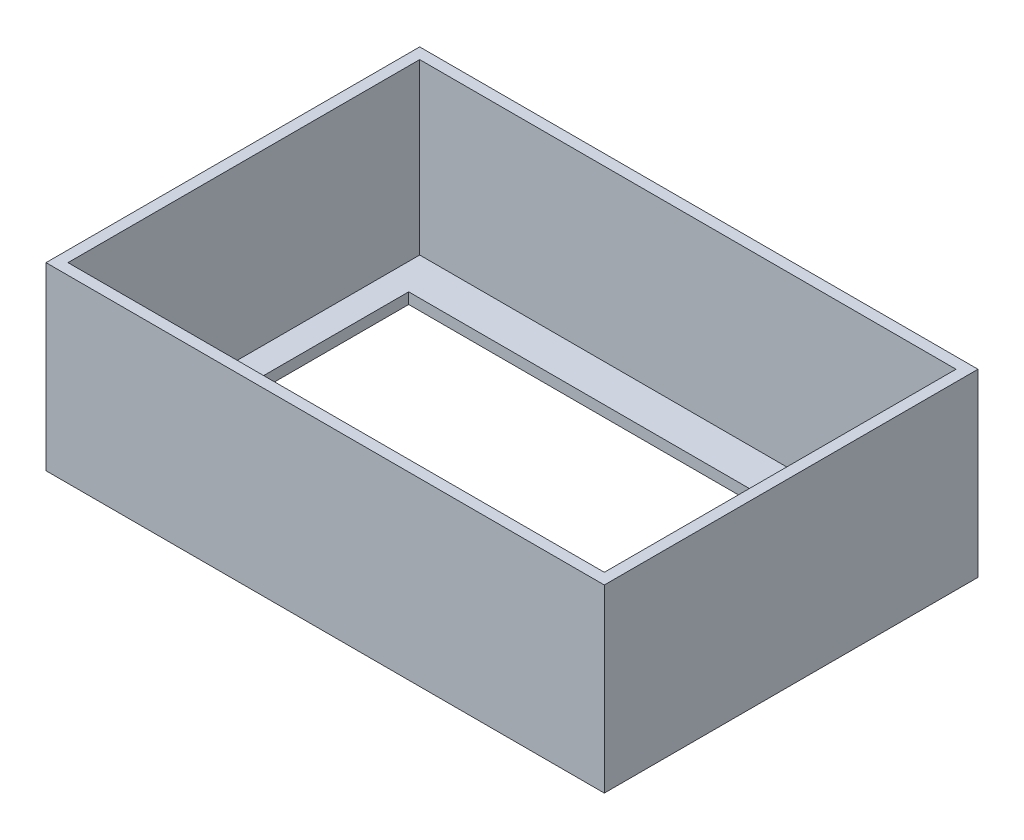
ISO-10303-21;
HEADER;
FILE_DESCRIPTION(('STEP AP214'),'2;1');
FILE_NAME('part.step','',(''),(''),'','','');
FILE_SCHEMA(('AUTOMOTIVE_DESIGN { 1 0 10303 214 1 1 1 1 }'));
ENDSEC;
DATA;
#1=APPLICATION_CONTEXT('core data for automotive mechanical design processes');
#2=APPLICATION_PROTOCOL_DEFINITION('international standard','automotive_design',2000,#1);
#3=PRODUCT_CONTEXT('',#1,'mechanical');
#4=PRODUCT('Part','Part','',(#3));
#5=PRODUCT_RELATED_PRODUCT_CATEGORY('part','',(#4));
#6=PRODUCT_DEFINITION_FORMATION('','',#4);
#7=PRODUCT_DEFINITION_CONTEXT('part definition',#1,'design');
#8=PRODUCT_DEFINITION('design','',#6,#7);
#9=PRODUCT_DEFINITION_SHAPE('','',#8);
#10=(LENGTH_UNIT() NAMED_UNIT(*) SI_UNIT(.MILLI.,.METRE.));
#11=(NAMED_UNIT(*) PLANE_ANGLE_UNIT() SI_UNIT($,.RADIAN.));
#12=(NAMED_UNIT(*) SI_UNIT($,.STERADIAN.) SOLID_ANGLE_UNIT());
#13=UNCERTAINTY_MEASURE_WITH_UNIT(LENGTH_MEASURE(1.E-05),#10,'distance_accuracy_value','');
#14=(GEOMETRIC_REPRESENTATION_CONTEXT(3) GLOBAL_UNCERTAINTY_ASSIGNED_CONTEXT((#13)) GLOBAL_UNIT_ASSIGNED_CONTEXT((#10,
#11,#12)) REPRESENTATION_CONTEXT('',''));
#15=CARTESIAN_POINT('',(0.,0.,0.));
#16=DIRECTION('',(0.,0.,1.));
#17=DIRECTION('',(1.,0.,0.));
#18=AXIS2_PLACEMENT_3D('',#15,#16,#17);
#19=CARTESIAN_POINT('',(0.,2.5,0.));
#20=DIRECTION('',(1.,0.,0.));
#21=DIRECTION('',(0.,0.,-1.));
#22=AXIS2_PLACEMENT_3D('',#19,#20,#21);
#23=PLANE('',#22);
#24=DIRECTION('',(0.,0.,1.));
#25=VECTOR('',#24,1.);
#26=CARTESIAN_POINT('',(0.,0.,0.));
#27=LINE('',#26,#25);
#28=CARTESIAN_POINT('',(0.,0.,-85.));
#29=VERTEX_POINT('',#28);
#30=CARTESIAN_POINT('',(0.,0.,0.));
#31=VERTEX_POINT('',#30);
#32=EDGE_CURVE('E198',#29,#31,#27,.T.);
#33=ORIENTED_EDGE('',*,*,#32,.T.);
#34=DIRECTION('',(0.,-1.,0.));
#35=VECTOR('',#34,1.);
#36=CARTESIAN_POINT('',(0.,2.5,0.));
#37=LINE('',#36,#35);
#38=CARTESIAN_POINT('',(0.,41.,0.));
#39=VERTEX_POINT('',#38);
#40=EDGE_CURVE('E11',#39,#31,#37,.T.);
#41=ORIENTED_EDGE('',*,*,#40,.F.);
#42=DIRECTION('',(0.,0.,1.));
#43=VECTOR('',#42,1.);
#44=CARTESIAN_POINT('',(0.,41.,0.));
#45=LINE('',#44,#43);
#46=CARTESIAN_POINT('',(0.,41.,-85.));
#47=VERTEX_POINT('',#46);
#48=EDGE_CURVE('E186',#47,#39,#45,.T.);
#49=ORIENTED_EDGE('',*,*,#48,.F.);
#50=DIRECTION('',(0.,-1.,0.));
#51=VECTOR('',#50,1.);
#52=CARTESIAN_POINT('',(0.,2.5,-85.));
#53=LINE('',#52,#51);
#54=EDGE_CURVE('E207',#47,#29,#53,.T.);
#55=ORIENTED_EDGE('',*,*,#54,.T.);
#56=EDGE_LOOP('',(#33,#41,#49,#55));
#57=FACE_BOUND('',#56,.T.);
#58=ADVANCED_FACE('F32',(#57),#23,.F.);
#59=CARTESIAN_POINT('',(0.,2.5,0.));
#60=DIRECTION('',(0.,0.,-1.));
#61=DIRECTION('',(-1.,0.,0.));
#62=AXIS2_PLACEMENT_3D('',#59,#60,#61);
#63=PLANE('',#62);
#64=DIRECTION('',(1.,0.,0.));
#65=VECTOR('',#64,1.);
#66=CARTESIAN_POINT('',(0.,0.,0.));
#67=LINE('',#66,#65);
#68=CARTESIAN_POINT('',(127.,0.,0.));
#69=VERTEX_POINT('',#68);
#70=EDGE_CURVE('E201',#31,#69,#67,.T.);
#71=ORIENTED_EDGE('',*,*,#70,.T.);
#72=DIRECTION('',(0.,-1.,0.));
#73=VECTOR('',#72,1.);
#74=CARTESIAN_POINT('',(127.,2.5,0.));
#75=LINE('',#74,#73);
#76=CARTESIAN_POINT('',(127.,41.,0.));
#77=VERTEX_POINT('',#76);
#78=EDGE_CURVE('E39',#77,#69,#75,.T.);
#79=ORIENTED_EDGE('',*,*,#78,.F.);
#80=DIRECTION('',(1.,0.,0.));
#81=VECTOR('',#80,1.);
#82=CARTESIAN_POINT('',(127.,41.,0.));
#83=LINE('',#82,#81);
#84=EDGE_CURVE('E189',#39,#77,#83,.T.);
#85=ORIENTED_EDGE('',*,*,#84,.F.);
#86=ORIENTED_EDGE('',*,*,#40,.T.);
#87=EDGE_LOOP('',(#71,#79,#85,#86));
#88=FACE_BOUND('',#87,.T.);
#89=ADVANCED_FACE('F231',(#88),#63,.F.);
#90=CARTESIAN_POINT('',(127.,2.5,0.));
#91=DIRECTION('',(-1.,0.,0.));
#92=DIRECTION('',(0.,0.,1.));
#93=AXIS2_PLACEMENT_3D('',#90,#91,#92);
#94=PLANE('',#93);
#95=DIRECTION('',(0.,0.,-1.));
#96=VECTOR('',#95,1.);
#97=CARTESIAN_POINT('',(127.,0.,0.));
#98=LINE('',#97,#96);
#99=CARTESIAN_POINT('',(127.,0.,-85.));
#100=VERTEX_POINT('',#99);
#101=EDGE_CURVE('E203',#69,#100,#98,.T.);
#102=ORIENTED_EDGE('',*,*,#101,.T.);
#103=DIRECTION('',(0.,-1.,0.));
#104=VECTOR('',#103,1.);
#105=CARTESIAN_POINT('',(127.,2.5,-85.));
#106=LINE('',#105,#104);
#107=CARTESIAN_POINT('',(127.,41.,-85.));
#108=VERTEX_POINT('',#107);
#109=EDGE_CURVE('E210',#108,#100,#106,.T.);
#110=ORIENTED_EDGE('',*,*,#109,.F.);
#111=DIRECTION('',(0.,0.,-1.));
#112=VECTOR('',#111,1.);
#113=CARTESIAN_POINT('',(127.,41.,-85.));
#114=LINE('',#113,#112);
#115=EDGE_CURVE('E192',#77,#108,#114,.T.);
#116=ORIENTED_EDGE('',*,*,#115,.F.);
#117=ORIENTED_EDGE('',*,*,#78,.T.);
#118=EDGE_LOOP('',(#102,#110,#116,#117));
#119=FACE_BOUND('',#118,.T.);
#120=ADVANCED_FACE('F216',(#119),#94,.F.);
#121=CARTESIAN_POINT('',(0.,2.5,-85.));
#122=DIRECTION('',(0.,0.,1.));
#123=DIRECTION('',(1.,0.,0.));
#124=AXIS2_PLACEMENT_3D('',#121,#122,#123);
#125=PLANE('',#124);
#126=DIRECTION('',(-1.,0.,0.));
#127=VECTOR('',#126,1.);
#128=CARTESIAN_POINT('',(0.,0.,-85.));
#129=LINE('',#128,#127);
#130=EDGE_CURVE('E205',#100,#29,#129,.T.);
#131=ORIENTED_EDGE('',*,*,#130,.T.);
#132=ORIENTED_EDGE('',*,*,#54,.F.);
#133=DIRECTION('',(-1.,0.,0.));
#134=VECTOR('',#133,1.);
#135=CARTESIAN_POINT('',(0.,41.,-85.));
#136=LINE('',#135,#134);
#137=EDGE_CURVE('E195',#108,#47,#136,.T.);
#138=ORIENTED_EDGE('',*,*,#137,.F.);
#139=ORIENTED_EDGE('',*,*,#109,.T.);
#140=EDGE_LOOP('',(#131,#132,#138,#139));
#141=FACE_BOUND('',#140,.T.);
#142=ADVANCED_FACE('F224',(#141),#125,.F.);
#143=CARTESIAN_POINT('',(0.,0.,0.));
#144=DIRECTION('',(0.,-1.,0.));
#145=DIRECTION('',(0.,0.,-1.));
#146=AXIS2_PLACEMENT_3D('',#143,#144,#145);
#147=PLANE('',#146);
#148=DIRECTION('',(0.,0.,-1.));
#149=VECTOR('',#148,1.);
#150=CARTESIAN_POINT('',(8.50000000000001,0.,-5.5));
#151=LINE('',#150,#149);
#152=CARTESIAN_POINT('',(8.50000000000001,0.,-5.5));
#153=VERTEX_POINT('',#152);
#154=CARTESIAN_POINT('',(8.50000000000001,0.,-74.));
#155=VERTEX_POINT('',#154);
#156=EDGE_CURVE('E54',#153,#155,#151,.T.);
#157=ORIENTED_EDGE('',*,*,#156,.F.);
#158=DIRECTION('',(-1.,0.,0.));
#159=VECTOR('',#158,1.);
#160=CARTESIAN_POINT('',(8.50000000000001,0.,-5.5));
#161=LINE('',#160,#159);
#162=CARTESIAN_POINT('',(118.5,0.,-5.49999999999999));
#163=VERTEX_POINT('',#162);
#164=EDGE_CURVE('E138',#163,#153,#161,.T.);
#165=ORIENTED_EDGE('',*,*,#164,.F.);
#166=DIRECTION('',(0.,0.,1.));
#167=VECTOR('',#166,1.);
#168=CARTESIAN_POINT('',(118.5,0.,-5.49999999999999));
#169=LINE('',#168,#167);
#170=CARTESIAN_POINT('',(118.5,0.,-74.));
#171=VERTEX_POINT('',#170);
#172=EDGE_CURVE('E141',#171,#163,#169,.T.);
#173=ORIENTED_EDGE('',*,*,#172,.F.);
#174=DIRECTION('',(1.,0.,0.));
#175=VECTOR('',#174,1.);
#176=CARTESIAN_POINT('',(8.50000000000001,0.,-74.));
#177=LINE('',#176,#175);
#178=EDGE_CURVE('E147',#155,#171,#177,.T.);
#179=ORIENTED_EDGE('',*,*,#178,.F.);
#180=EDGE_LOOP('',(#157,#165,#173,#179));
#181=FACE_BOUND('',#180,.T.);
#182=ORIENTED_EDGE('',*,*,#32,.F.);
#183=ORIENTED_EDGE('',*,*,#130,.F.);
#184=ORIENTED_EDGE('',*,*,#101,.F.);
#185=ORIENTED_EDGE('',*,*,#70,.F.);
#186=EDGE_LOOP('',(#182,#183,#184,#185));
#187=FACE_BOUND('',#186,.T.);
#188=ADVANCED_FACE('F222',(#181,#187),#147,.T.);
#189=CARTESIAN_POINT('',(0.,41.,0.));
#190=DIRECTION('',(0.,-1.,0.));
#191=DIRECTION('',(0.,0.,-1.));
#192=AXIS2_PLACEMENT_3D('',#189,#190,#191);
#193=PLANE('',#192);
#194=ORIENTED_EDGE('',*,*,#48,.T.);
#195=ORIENTED_EDGE('',*,*,#84,.T.);
#196=ORIENTED_EDGE('',*,*,#115,.T.);
#197=ORIENTED_EDGE('',*,*,#137,.T.);
#198=EDGE_LOOP('',(#194,#195,#196,#197));
#199=FACE_BOUND('',#198,.T.);
#200=DIRECTION('',(0.,0.,1.));
#201=VECTOR('',#200,1.);
#202=CARTESIAN_POINT('',(2.5,41.,-82.5));
#203=LINE('',#202,#201);
#204=CARTESIAN_POINT('',(2.5,41.,-82.5));
#205=VERTEX_POINT('',#204);
#206=CARTESIAN_POINT('',(2.50000000000001,41.,-2.49999999999998));
#207=VERTEX_POINT('',#206);
#208=EDGE_CURVE('E157',#205,#207,#203,.T.);
#209=ORIENTED_EDGE('',*,*,#208,.F.);
#210=DIRECTION('',(-1.,0.,0.));
#211=VECTOR('',#210,1.);
#212=CARTESIAN_POINT('',(2.5,41.,-82.5));
#213=LINE('',#212,#211);
#214=CARTESIAN_POINT('',(124.5,41.,-82.5));
#215=VERTEX_POINT('',#214);
#216=EDGE_CURVE('E165',#215,#205,#213,.T.);
#217=ORIENTED_EDGE('',*,*,#216,.F.);
#218=DIRECTION('',(0.,0.,-1.));
#219=VECTOR('',#218,1.);
#220=CARTESIAN_POINT('',(124.5,41.,-82.5));
#221=LINE('',#220,#219);
#222=CARTESIAN_POINT('',(124.5,41.,-2.49999999999998));
#223=VERTEX_POINT('',#222);
#224=EDGE_CURVE('E162',#223,#215,#221,.T.);
#225=ORIENTED_EDGE('',*,*,#224,.F.);
#226=DIRECTION('',(1.,0.,0.));
#227=VECTOR('',#226,1.);
#228=CARTESIAN_POINT('',(2.50000000000001,41.,-2.49999999999998));
#229=LINE('',#228,#227);
#230=EDGE_CURVE('E159',#207,#223,#229,.T.);
#231=ORIENTED_EDGE('',*,*,#230,.F.);
#232=EDGE_LOOP('',(#209,#217,#225,#231));
#233=FACE_BOUND('',#232,.T.);
#234=ADVANCED_FACE('F229',(#199,#233),#193,.F.);
#235=CARTESIAN_POINT('',(2.5,41.,-82.5));
#236=DIRECTION('',(1.,0.,0.));
#237=DIRECTION('',(0.,0.,-1.));
#238=AXIS2_PLACEMENT_3D('',#235,#236,#237);
#239=PLANE('',#238);
#240=DIRECTION('',(0.,0.,1.));
#241=VECTOR('',#240,1.);
#242=CARTESIAN_POINT('',(2.5,2.5,-82.5));
#243=LINE('',#242,#241);
#244=CARTESIAN_POINT('',(2.5,2.5,-82.5));
#245=VERTEX_POINT('',#244);
#246=CARTESIAN_POINT('',(2.50000000000001,2.5,-2.49999999999998));
#247=VERTEX_POINT('',#246);
#248=EDGE_CURVE('E153',#245,#247,#243,.T.);
#249=ORIENTED_EDGE('',*,*,#248,.F.);
#250=DIRECTION('',(0.,-1.,0.));
#251=VECTOR('',#250,1.);
#252=CARTESIAN_POINT('',(2.5,41.,-82.5));
#253=LINE('',#252,#251);
#254=EDGE_CURVE('E167',#205,#245,#253,.T.);
#255=ORIENTED_EDGE('',*,*,#254,.F.);
#256=ORIENTED_EDGE('',*,*,#208,.T.);
#257=DIRECTION('',(0.,-1.,0.));
#258=VECTOR('',#257,1.);
#259=CARTESIAN_POINT('',(2.50000000000001,41.,-2.49999999999998));
#260=LINE('',#259,#258);
#261=EDGE_CURVE('E183',#207,#247,#260,.T.);
#262=ORIENTED_EDGE('',*,*,#261,.T.);
#263=EDGE_LOOP('',(#249,#255,#256,#262));
#264=FACE_BOUND('',#263,.T.);
#265=ADVANCED_FACE('F249',(#264),#239,.T.);
#266=CARTESIAN_POINT('',(2.50000000000001,41.,-2.49999999999998));
#267=DIRECTION('',(0.,0.,-1.));
#268=DIRECTION('',(-1.,0.,0.));
#269=AXIS2_PLACEMENT_3D('',#266,#267,#268);
#270=PLANE('',#269);
#271=DIRECTION('',(1.,0.,0.));
#272=VECTOR('',#271,1.);
#273=CARTESIAN_POINT('',(2.50000000000001,2.5,-2.49999999999998));
#274=LINE('',#273,#272);
#275=CARTESIAN_POINT('',(124.5,2.5,-2.49999999999998));
#276=VERTEX_POINT('',#275);
#277=EDGE_CURVE('E170',#247,#276,#274,.T.);
#278=ORIENTED_EDGE('',*,*,#277,.F.);
#279=ORIENTED_EDGE('',*,*,#261,.F.);
#280=ORIENTED_EDGE('',*,*,#230,.T.);
#281=DIRECTION('',(0.,-1.,0.));
#282=VECTOR('',#281,1.);
#283=CARTESIAN_POINT('',(124.5,41.,-2.49999999999998));
#284=LINE('',#283,#282);
#285=EDGE_CURVE('E181',#223,#276,#284,.T.);
#286=ORIENTED_EDGE('',*,*,#285,.T.);
#287=EDGE_LOOP('',(#278,#279,#280,#286));
#288=FACE_BOUND('',#287,.T.);
#289=ADVANCED_FACE('F252',(#288),#270,.T.);
#290=CARTESIAN_POINT('',(124.5,41.,-82.5));
#291=DIRECTION('',(-1.,0.,0.));
#292=DIRECTION('',(0.,0.,1.));
#293=AXIS2_PLACEMENT_3D('',#290,#291,#292);
#294=PLANE('',#293);
#295=DIRECTION('',(0.,0.,-1.));
#296=VECTOR('',#295,1.);
#297=CARTESIAN_POINT('',(124.5,2.5,-82.5));
#298=LINE('',#297,#296);
#299=CARTESIAN_POINT('',(124.5,2.5,-82.5));
#300=VERTEX_POINT('',#299);
#301=EDGE_CURVE('E173',#276,#300,#298,.T.);
#302=ORIENTED_EDGE('',*,*,#301,.F.);
#303=ORIENTED_EDGE('',*,*,#285,.F.);
#304=ORIENTED_EDGE('',*,*,#224,.T.);
#305=DIRECTION('',(0.,-1.,0.));
#306=VECTOR('',#305,1.);
#307=CARTESIAN_POINT('',(124.5,41.,-82.5));
#308=LINE('',#307,#306);
#309=EDGE_CURVE('E179',#215,#300,#308,.T.);
#310=ORIENTED_EDGE('',*,*,#309,.T.);
#311=EDGE_LOOP('',(#302,#303,#304,#310));
#312=FACE_BOUND('',#311,.T.);
#313=ADVANCED_FACE('F256',(#312),#294,.T.);
#314=CARTESIAN_POINT('',(2.5,41.,-82.5));
#315=DIRECTION('',(0.,0.,1.));
#316=DIRECTION('',(1.,0.,0.));
#317=AXIS2_PLACEMENT_3D('',#314,#315,#316);
#318=PLANE('',#317);
#319=DIRECTION('',(-1.,0.,0.));
#320=VECTOR('',#319,1.);
#321=CARTESIAN_POINT('',(2.5,2.5,-82.5));
#322=LINE('',#321,#320);
#323=EDGE_CURVE('E160',#300,#245,#322,.T.);
#324=ORIENTED_EDGE('',*,*,#323,.F.);
#325=ORIENTED_EDGE('',*,*,#309,.F.);
#326=ORIENTED_EDGE('',*,*,#216,.T.);
#327=ORIENTED_EDGE('',*,*,#254,.T.);
#328=EDGE_LOOP('',(#324,#325,#326,#327));
#329=FACE_BOUND('',#328,.T.);
#330=ADVANCED_FACE('F246',(#329),#318,.T.);
#331=CARTESIAN_POINT('',(0.,2.5,0.));
#332=DIRECTION('',(0.,-1.,0.));
#333=DIRECTION('',(0.,0.,-1.));
#334=AXIS2_PLACEMENT_3D('',#331,#332,#333);
#335=PLANE('',#334);
#336=DIRECTION('',(-1.,0.,0.));
#337=VECTOR('',#336,1.);
#338=CARTESIAN_POINT('',(8.50000000000001,2.5,-5.5));
#339=LINE('',#338,#337);
#340=CARTESIAN_POINT('',(118.5,2.5,-5.49999999999999));
#341=VERTEX_POINT('',#340);
#342=CARTESIAN_POINT('',(8.50000000000001,2.5,-5.5));
#343=VERTEX_POINT('',#342);
#344=EDGE_CURVE('E128',#341,#343,#339,.T.);
#345=ORIENTED_EDGE('',*,*,#344,.T.);
#346=DIRECTION('',(0.,0.,-1.));
#347=VECTOR('',#346,1.);
#348=CARTESIAN_POINT('',(8.50000000000001,2.5,-5.5));
#349=LINE('',#348,#347);
#350=CARTESIAN_POINT('',(8.50000000000001,2.5,-74.));
#351=VERTEX_POINT('',#350);
#352=EDGE_CURVE('E122',#343,#351,#349,.T.);
#353=ORIENTED_EDGE('',*,*,#352,.T.);
#354=DIRECTION('',(1.,0.,0.));
#355=VECTOR('',#354,1.);
#356=CARTESIAN_POINT('',(8.50000000000001,2.5,-74.));
#357=LINE('',#356,#355);
#358=CARTESIAN_POINT('',(118.5,2.5,-74.));
#359=VERTEX_POINT('',#358);
#360=EDGE_CURVE('E131',#351,#359,#357,.T.);
#361=ORIENTED_EDGE('',*,*,#360,.T.);
#362=DIRECTION('',(0.,0.,1.));
#363=VECTOR('',#362,1.);
#364=CARTESIAN_POINT('',(118.5,2.5,-5.49999999999999));
#365=LINE('',#364,#363);
#366=EDGE_CURVE('E46',#359,#341,#365,.T.);
#367=ORIENTED_EDGE('',*,*,#366,.T.);
#368=EDGE_LOOP('',(#345,#353,#361,#367));
#369=FACE_BOUND('',#368,.T.);
#370=ORIENTED_EDGE('',*,*,#323,.T.);
#371=ORIENTED_EDGE('',*,*,#248,.T.);
#372=ORIENTED_EDGE('',*,*,#277,.T.);
#373=ORIENTED_EDGE('',*,*,#301,.T.);
#374=EDGE_LOOP('',(#370,#371,#372,#373));
#375=FACE_BOUND('',#374,.T.);
#376=ADVANCED_FACE('F135',(#369,#375),#335,.F.);
#377=CARTESIAN_POINT('',(8.50000000000001,2.5,-5.5));
#378=DIRECTION('',(-1.,0.,0.));
#379=DIRECTION('',(0.,0.,1.));
#380=AXIS2_PLACEMENT_3D('',#377,#378,#379);
#381=PLANE('',#380);
#382=ORIENTED_EDGE('',*,*,#156,.T.);
#383=DIRECTION('',(0.,-1.,0.));
#384=VECTOR('',#383,1.);
#385=CARTESIAN_POINT('',(8.50000000000001,2.5,-74.));
#386=LINE('',#385,#384);
#387=EDGE_CURVE('E118',#351,#155,#386,.T.);
#388=ORIENTED_EDGE('',*,*,#387,.F.);
#389=ORIENTED_EDGE('',*,*,#352,.F.);
#390=DIRECTION('',(0.,-1.,0.));
#391=VECTOR('',#390,1.);
#392=CARTESIAN_POINT('',(8.50000000000001,2.5,-5.5));
#393=LINE('',#392,#391);
#394=EDGE_CURVE('E151',#343,#153,#393,.T.);
#395=ORIENTED_EDGE('',*,*,#394,.T.);
#396=EDGE_LOOP('',(#382,#388,#389,#395));
#397=FACE_BOUND('',#396,.T.);
#398=ADVANCED_FACE('F120',(#397),#381,.F.);
#399=CARTESIAN_POINT('',(8.50000000000001,2.5,-5.5));
#400=DIRECTION('',(0.,0.,1.));
#401=DIRECTION('',(1.,0.,0.));
#402=AXIS2_PLACEMENT_3D('',#399,#400,#401);
#403=PLANE('',#402);
#404=ORIENTED_EDGE('',*,*,#164,.T.);
#405=ORIENTED_EDGE('',*,*,#394,.F.);
#406=ORIENTED_EDGE('',*,*,#344,.F.);
#407=DIRECTION('',(0.,-1.,0.));
#408=VECTOR('',#407,1.);
#409=CARTESIAN_POINT('',(118.5,2.5,-5.49999999999999));
#410=LINE('',#409,#408);
#411=EDGE_CURVE('E154',#341,#163,#410,.T.);
#412=ORIENTED_EDGE('',*,*,#411,.T.);
#413=EDGE_LOOP('',(#404,#405,#406,#412));
#414=FACE_BOUND('',#413,.T.);
#415=ADVANCED_FACE('F266',(#414),#403,.F.);
#416=CARTESIAN_POINT('',(118.5,2.5,-5.49999999999999));
#417=DIRECTION('',(1.,0.,0.));
#418=DIRECTION('',(0.,0.,-1.));
#419=AXIS2_PLACEMENT_3D('',#416,#417,#418);
#420=PLANE('',#419);
#421=ORIENTED_EDGE('',*,*,#172,.T.);
#422=ORIENTED_EDGE('',*,*,#411,.F.);
#423=ORIENTED_EDGE('',*,*,#366,.F.);
#424=DIRECTION('',(0.,-1.,0.));
#425=VECTOR('',#424,1.);
#426=CARTESIAN_POINT('',(118.5,2.5,-74.));
#427=LINE('',#426,#425);
#428=EDGE_CURVE('E127',#359,#171,#427,.T.);
#429=ORIENTED_EDGE('',*,*,#428,.T.);
#430=EDGE_LOOP('',(#421,#422,#423,#429));
#431=FACE_BOUND('',#430,.T.);
#432=ADVANCED_FACE('F269',(#431),#420,.F.);
#433=CARTESIAN_POINT('',(8.50000000000001,2.5,-74.));
#434=DIRECTION('',(0.,0.,-1.));
#435=DIRECTION('',(-1.,0.,0.));
#436=AXIS2_PLACEMENT_3D('',#433,#434,#435);
#437=PLANE('',#436);
#438=ORIENTED_EDGE('',*,*,#178,.T.);
#439=ORIENTED_EDGE('',*,*,#428,.F.);
#440=ORIENTED_EDGE('',*,*,#360,.F.);
#441=ORIENTED_EDGE('',*,*,#387,.T.);
#442=EDGE_LOOP('',(#438,#439,#440,#441));
#443=FACE_BOUND('',#442,.T.);
#444=ADVANCED_FACE('F132',(#443),#437,.F.);
#445=CLOSED_SHELL('',(#58,#89,#120,#142,#188,#234,#265,#289,#313,#330,#376,#398,#415,#432,#444));
#446=MANIFOLD_SOLID_BREP('B2',#445);
#447=ADVANCED_BREP_SHAPE_REPRESENTATION('',(#18,#446),#14);
#448=SHAPE_DEFINITION_REPRESENTATION(#9,#447);
ENDSEC;
END-ISO-10303-21;
